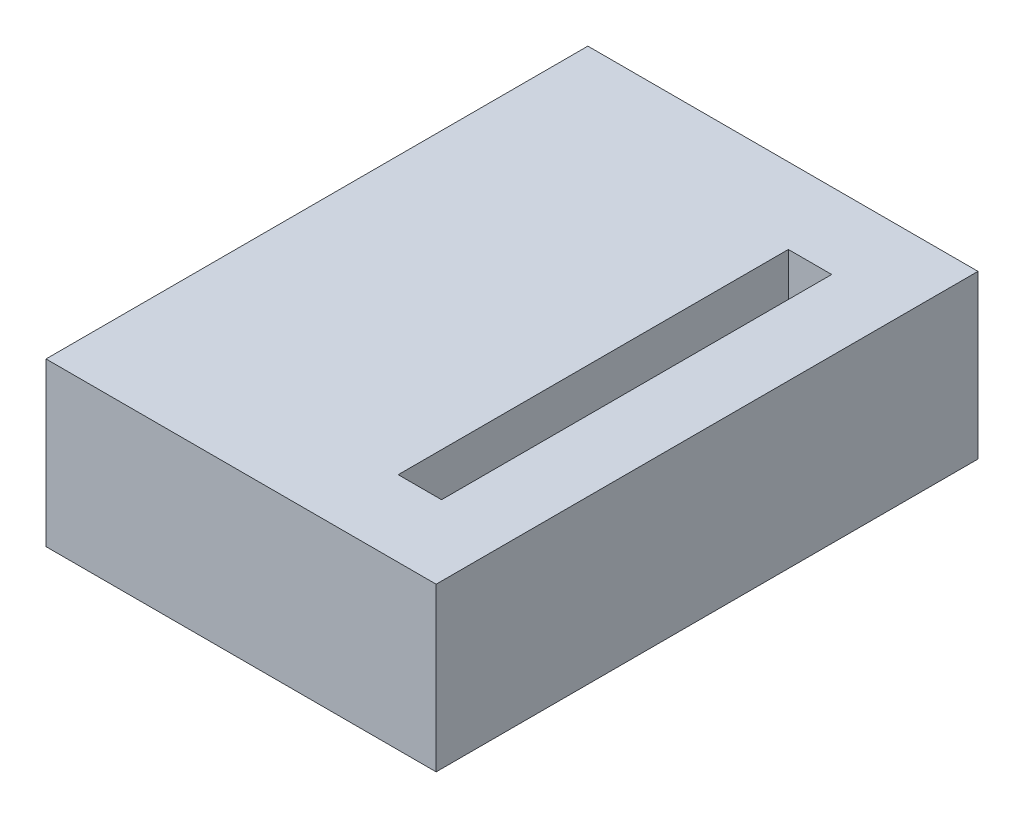
ISO-10303-21;
HEADER;
FILE_DESCRIPTION(('STEP AP214'),'2;1');
FILE_NAME('part.step','',(''),(''),'','','');
FILE_SCHEMA(('AUTOMOTIVE_DESIGN { 1 0 10303 214 1 1 1 1 }'));
ENDSEC;
DATA;
#1=APPLICATION_CONTEXT('core data for automotive mechanical design processes');
#2=APPLICATION_PROTOCOL_DEFINITION('international standard','automotive_design',2000,#1);
#3=PRODUCT_CONTEXT('',#1,'mechanical');
#4=PRODUCT('Part','Part','',(#3));
#5=PRODUCT_RELATED_PRODUCT_CATEGORY('part','',(#4));
#6=PRODUCT_DEFINITION_FORMATION('','',#4);
#7=PRODUCT_DEFINITION_CONTEXT('part definition',#1,'design');
#8=PRODUCT_DEFINITION('design','',#6,#7);
#9=PRODUCT_DEFINITION_SHAPE('','',#8);
#10=(LENGTH_UNIT() NAMED_UNIT(*) SI_UNIT(.MILLI.,.METRE.));
#11=(NAMED_UNIT(*) PLANE_ANGLE_UNIT() SI_UNIT($,.RADIAN.));
#12=(NAMED_UNIT(*) SI_UNIT($,.STERADIAN.) SOLID_ANGLE_UNIT());
#13=UNCERTAINTY_MEASURE_WITH_UNIT(LENGTH_MEASURE(1.E-05),#10,'distance_accuracy_value','');
#14=(GEOMETRIC_REPRESENTATION_CONTEXT(3) GLOBAL_UNCERTAINTY_ASSIGNED_CONTEXT((#13)) GLOBAL_UNIT_ASSIGNED_CONTEXT((#10,
#11,#12)) REPRESENTATION_CONTEXT('',''));
#15=CARTESIAN_POINT('',(0.,0.,0.));
#16=DIRECTION('',(0.,0.,1.));
#17=DIRECTION('',(1.,0.,0.));
#18=AXIS2_PLACEMENT_3D('',#15,#16,#17);
#19=CARTESIAN_POINT('',(0.,3.81,0.));
#20=DIRECTION('',(1.,0.,0.));
#21=DIRECTION('',(0.,0.,-1.));
#22=AXIS2_PLACEMENT_3D('',#19,#20,#21);
#23=PLANE('',#22);
#24=DIRECTION('',(0.,0.,1.));
#25=VECTOR('',#24,1.);
#26=CARTESIAN_POINT('',(0.,0.,0.));
#27=LINE('',#26,#25);
#28=CARTESIAN_POINT('',(0.,0.,-12.7));
#29=VERTEX_POINT('',#28);
#30=CARTESIAN_POINT('',(0.,0.,0.));
#31=VERTEX_POINT('',#30);
#32=EDGE_CURVE('E130',#29,#31,#27,.T.);
#33=ORIENTED_EDGE('',*,*,#32,.T.);
#34=DIRECTION('',(0.,-1.,0.));
#35=VECTOR('',#34,1.);
#36=CARTESIAN_POINT('',(0.,3.81,0.));
#37=LINE('',#36,#35);
#38=CARTESIAN_POINT('',(0.,3.81,0.));
#39=VERTEX_POINT('',#38);
#40=EDGE_CURVE('E11',#39,#31,#37,.T.);
#41=ORIENTED_EDGE('',*,*,#40,.F.);
#42=DIRECTION('',(0.,0.,1.));
#43=VECTOR('',#42,1.);
#44=CARTESIAN_POINT('',(0.,3.81,0.));
#45=LINE('',#44,#43);
#46=CARTESIAN_POINT('',(0.,3.81,-12.7));
#47=VERTEX_POINT('',#46);
#48=EDGE_CURVE('E134',#47,#39,#45,.T.);
#49=ORIENTED_EDGE('',*,*,#48,.F.);
#50=DIRECTION('',(0.,-1.,0.));
#51=VECTOR('',#50,1.);
#52=CARTESIAN_POINT('',(0.,3.81,-12.7));
#53=LINE('',#52,#51);
#54=EDGE_CURVE('E144',#47,#29,#53,.T.);
#55=ORIENTED_EDGE('',*,*,#54,.T.);
#56=EDGE_LOOP('',(#33,#41,#49,#55));
#57=FACE_BOUND('',#56,.T.);
#58=ADVANCED_FACE('F33',(#57),#23,.F.);
#59=CARTESIAN_POINT('',(0.,3.81,0.));
#60=DIRECTION('',(0.,0.,-1.));
#61=DIRECTION('',(-1.,0.,0.));
#62=AXIS2_PLACEMENT_3D('',#59,#60,#61);
#63=PLANE('',#62);
#64=DIRECTION('',(1.,0.,0.));
#65=VECTOR('',#64,1.);
#66=CARTESIAN_POINT('',(0.,0.,0.));
#67=LINE('',#66,#65);
#68=CARTESIAN_POINT('',(9.144,0.,0.));
#69=VERTEX_POINT('',#68);
#70=EDGE_CURVE('E147',#31,#69,#67,.T.);
#71=ORIENTED_EDGE('',*,*,#70,.T.);
#72=DIRECTION('',(0.,-1.,0.));
#73=VECTOR('',#72,1.);
#74=CARTESIAN_POINT('',(9.144,3.81,0.));
#75=LINE('',#74,#73);
#76=CARTESIAN_POINT('',(9.144,3.81,0.));
#77=VERTEX_POINT('',#76);
#78=EDGE_CURVE('E40',#77,#69,#75,.T.);
#79=ORIENTED_EDGE('',*,*,#78,.F.);
#80=DIRECTION('',(1.,0.,0.));
#81=VECTOR('',#80,1.);
#82=CARTESIAN_POINT('',(0.,3.81,0.));
#83=LINE('',#82,#81);
#84=EDGE_CURVE('E137',#39,#77,#83,.T.);
#85=ORIENTED_EDGE('',*,*,#84,.F.);
#86=ORIENTED_EDGE('',*,*,#40,.T.);
#87=EDGE_LOOP('',(#71,#79,#85,#86));
#88=FACE_BOUND('',#87,.T.);
#89=ADVANCED_FACE('F175',(#88),#63,.F.);
#90=CARTESIAN_POINT('',(9.144,3.81,0.));
#91=DIRECTION('',(-1.,0.,0.));
#92=DIRECTION('',(0.,0.,1.));
#93=AXIS2_PLACEMENT_3D('',#90,#91,#92);
#94=PLANE('',#93);
#95=DIRECTION('',(0.,0.,-1.));
#96=VECTOR('',#95,1.);
#97=CARTESIAN_POINT('',(9.144,0.,0.));
#98=LINE('',#97,#96);
#99=CARTESIAN_POINT('',(9.144,0.,-12.7));
#100=VERTEX_POINT('',#99);
#101=EDGE_CURVE('E149',#69,#100,#98,.T.);
#102=ORIENTED_EDGE('',*,*,#101,.T.);
#103=DIRECTION('',(0.,-1.,0.));
#104=VECTOR('',#103,1.);
#105=CARTESIAN_POINT('',(9.144,3.81,-12.7));
#106=LINE('',#105,#104);
#107=CARTESIAN_POINT('',(9.144,3.81,-12.7));
#108=VERTEX_POINT('',#107);
#109=EDGE_CURVE('E154',#108,#100,#106,.T.);
#110=ORIENTED_EDGE('',*,*,#109,.F.);
#111=DIRECTION('',(0.,0.,-1.));
#112=VECTOR('',#111,1.);
#113=CARTESIAN_POINT('',(9.144,3.81,0.));
#114=LINE('',#113,#112);
#115=EDGE_CURVE('E140',#77,#108,#114,.T.);
#116=ORIENTED_EDGE('',*,*,#115,.F.);
#117=ORIENTED_EDGE('',*,*,#78,.T.);
#118=EDGE_LOOP('',(#102,#110,#116,#117));
#119=FACE_BOUND('',#118,.T.);
#120=ADVANCED_FACE('F161',(#119),#94,.F.);
#121=CARTESIAN_POINT('',(0.,3.81,-12.7));
#122=DIRECTION('',(0.,0.,1.));
#123=DIRECTION('',(1.,0.,0.));
#124=AXIS2_PLACEMENT_3D('',#121,#122,#123);
#125=PLANE('',#124);
#126=DIRECTION('',(-1.,0.,0.));
#127=VECTOR('',#126,1.);
#128=CARTESIAN_POINT('',(0.,0.,-12.7));
#129=LINE('',#128,#127);
#130=EDGE_CURVE('E138',#100,#29,#129,.T.);
#131=ORIENTED_EDGE('',*,*,#130,.T.);
#132=ORIENTED_EDGE('',*,*,#54,.F.);
#133=DIRECTION('',(-1.,0.,0.));
#134=VECTOR('',#133,1.);
#135=CARTESIAN_POINT('',(0.,3.81,-12.7));
#136=LINE('',#135,#134);
#137=EDGE_CURVE('E142',#108,#47,#136,.T.);
#138=ORIENTED_EDGE('',*,*,#137,.F.);
#139=ORIENTED_EDGE('',*,*,#109,.T.);
#140=EDGE_LOOP('',(#131,#132,#138,#139));
#141=FACE_BOUND('',#140,.T.);
#142=ADVANCED_FACE('F168',(#141),#125,.F.);
#143=CARTESIAN_POINT('',(0.,3.81,0.));
#144=DIRECTION('',(0.,-1.,0.));
#145=DIRECTION('',(0.,0.,-1.));
#146=AXIS2_PLACEMENT_3D('',#143,#144,#145);
#147=PLANE('',#146);
#148=DIRECTION('',(-1.,0.,0.));
#149=VECTOR('',#148,1.);
#150=CARTESIAN_POINT('',(7.493,3.81,-10.922));
#151=LINE('',#150,#149);
#152=CARTESIAN_POINT('',(7.493,3.81,-10.922));
#153=VERTEX_POINT('',#152);
#154=CARTESIAN_POINT('',(6.477,3.81,-10.922));
#155=VERTEX_POINT('',#154);
#156=EDGE_CURVE('E124',#153,#155,#151,.T.);
#157=ORIENTED_EDGE('',*,*,#156,.F.);
#158=DIRECTION('',(0.,0.,-1.));
#159=VECTOR('',#158,1.);
#160=CARTESIAN_POINT('',(7.493,3.81,-1.778));
#161=LINE('',#160,#159);
#162=CARTESIAN_POINT('',(7.493,3.81,-1.778));
#163=VERTEX_POINT('',#162);
#164=EDGE_CURVE('E47',#163,#153,#161,.T.);
#165=ORIENTED_EDGE('',*,*,#164,.F.);
#166=DIRECTION('',(1.,0.,0.));
#167=VECTOR('',#166,1.);
#168=CARTESIAN_POINT('',(7.493,3.81,-1.778));
#169=LINE('',#168,#167);
#170=CARTESIAN_POINT('',(6.477,3.81,-1.778));
#171=VERTEX_POINT('',#170);
#172=EDGE_CURVE('E115',#171,#163,#169,.T.);
#173=ORIENTED_EDGE('',*,*,#172,.F.);
#174=DIRECTION('',(0.,0.,1.));
#175=VECTOR('',#174,1.);
#176=CARTESIAN_POINT('',(6.477,3.81,-1.778));
#177=LINE('',#176,#175);
#178=EDGE_CURVE('E118',#155,#171,#177,.T.);
#179=ORIENTED_EDGE('',*,*,#178,.F.);
#180=EDGE_LOOP('',(#157,#165,#173,#179));
#181=FACE_BOUND('',#180,.T.);
#182=ORIENTED_EDGE('',*,*,#48,.T.);
#183=ORIENTED_EDGE('',*,*,#84,.T.);
#184=ORIENTED_EDGE('',*,*,#115,.T.);
#185=ORIENTED_EDGE('',*,*,#137,.T.);
#186=EDGE_LOOP('',(#182,#183,#184,#185));
#187=FACE_BOUND('',#186,.T.);
#188=ADVANCED_FACE('F174',(#181,#187),#147,.F.);
#189=CARTESIAN_POINT('',(0.,0.,0.));
#190=DIRECTION('',(0.,-1.,0.));
#191=DIRECTION('',(0.,0.,-1.));
#192=AXIS2_PLACEMENT_3D('',#189,#190,#191);
#193=PLANE('',#192);
#194=DIRECTION('',(0.,0.,-1.));
#195=VECTOR('',#194,1.);
#196=CARTESIAN_POINT('',(7.493,0.,-1.778));
#197=LINE('',#196,#195);
#198=CARTESIAN_POINT('',(7.493,0.,-1.778));
#199=VERTEX_POINT('',#198);
#200=CARTESIAN_POINT('',(7.493,0.,-10.922));
#201=VERTEX_POINT('',#200);
#202=EDGE_CURVE('E99',#199,#201,#197,.T.);
#203=ORIENTED_EDGE('',*,*,#202,.T.);
#204=DIRECTION('',(-1.,0.,0.));
#205=VECTOR('',#204,1.);
#206=CARTESIAN_POINT('',(7.493,0.,-10.922));
#207=LINE('',#206,#205);
#208=CARTESIAN_POINT('',(6.477,0.,-10.922));
#209=VERTEX_POINT('',#208);
#210=EDGE_CURVE('E108',#201,#209,#207,.T.);
#211=ORIENTED_EDGE('',*,*,#210,.T.);
#212=DIRECTION('',(0.,0.,1.));
#213=VECTOR('',#212,1.);
#214=CARTESIAN_POINT('',(6.477,0.,-1.778));
#215=LINE('',#214,#213);
#216=CARTESIAN_POINT('',(6.477,0.,-1.778));
#217=VERTEX_POINT('',#216);
#218=EDGE_CURVE('E55',#209,#217,#215,.T.);
#219=ORIENTED_EDGE('',*,*,#218,.T.);
#220=DIRECTION('',(1.,0.,0.));
#221=VECTOR('',#220,1.);
#222=CARTESIAN_POINT('',(7.493,0.,-1.778));
#223=LINE('',#222,#221);
#224=EDGE_CURVE('E105',#217,#199,#223,.T.);
#225=ORIENTED_EDGE('',*,*,#224,.T.);
#226=EDGE_LOOP('',(#203,#211,#219,#225));
#227=FACE_BOUND('',#226,.T.);
#228=ORIENTED_EDGE('',*,*,#32,.F.);
#229=ORIENTED_EDGE('',*,*,#130,.F.);
#230=ORIENTED_EDGE('',*,*,#101,.F.);
#231=ORIENTED_EDGE('',*,*,#70,.F.);
#232=EDGE_LOOP('',(#228,#229,#230,#231));
#233=FACE_BOUND('',#232,.T.);
#234=ADVANCED_FACE('F112',(#227,#233),#193,.T.);
#235=CARTESIAN_POINT('',(7.493,0.,-1.778));
#236=DIRECTION('',(1.,0.,0.));
#237=DIRECTION('',(0.,0.,-1.));
#238=AXIS2_PLACEMENT_3D('',#235,#236,#237);
#239=PLANE('',#238);
#240=ORIENTED_EDGE('',*,*,#164,.T.);
#241=DIRECTION('',(0.,1.,0.));
#242=VECTOR('',#241,1.);
#243=CARTESIAN_POINT('',(7.493,0.,-10.922));
#244=LINE('',#243,#242);
#245=EDGE_CURVE('E95',#201,#153,#244,.T.);
#246=ORIENTED_EDGE('',*,*,#245,.F.);
#247=ORIENTED_EDGE('',*,*,#202,.F.);
#248=DIRECTION('',(0.,1.,0.));
#249=VECTOR('',#248,1.);
#250=CARTESIAN_POINT('',(7.493,0.,-1.778));
#251=LINE('',#250,#249);
#252=EDGE_CURVE('E128',#199,#163,#251,.T.);
#253=ORIENTED_EDGE('',*,*,#252,.T.);
#254=EDGE_LOOP('',(#240,#246,#247,#253));
#255=FACE_BOUND('',#254,.T.);
#256=ADVANCED_FACE('F97',(#255),#239,.F.);
#257=CARTESIAN_POINT('',(7.493,0.,-1.778));
#258=DIRECTION('',(0.,0.,1.));
#259=DIRECTION('',(1.,0.,0.));
#260=AXIS2_PLACEMENT_3D('',#257,#258,#259);
#261=PLANE('',#260);
#262=ORIENTED_EDGE('',*,*,#172,.T.);
#263=ORIENTED_EDGE('',*,*,#252,.F.);
#264=ORIENTED_EDGE('',*,*,#224,.F.);
#265=DIRECTION('',(0.,1.,0.));
#266=VECTOR('',#265,1.);
#267=CARTESIAN_POINT('',(6.477,0.,-1.778));
#268=LINE('',#267,#266);
#269=EDGE_CURVE('E131',#217,#171,#268,.T.);
#270=ORIENTED_EDGE('',*,*,#269,.T.);
#271=EDGE_LOOP('',(#262,#263,#264,#270));
#272=FACE_BOUND('',#271,.T.);
#273=ADVANCED_FACE('F192',(#272),#261,.F.);
#274=CARTESIAN_POINT('',(6.477,0.,-1.778));
#275=DIRECTION('',(-1.,0.,0.));
#276=DIRECTION('',(0.,0.,1.));
#277=AXIS2_PLACEMENT_3D('',#274,#275,#276);
#278=PLANE('',#277);
#279=ORIENTED_EDGE('',*,*,#178,.T.);
#280=ORIENTED_EDGE('',*,*,#269,.F.);
#281=ORIENTED_EDGE('',*,*,#218,.F.);
#282=DIRECTION('',(0.,1.,0.));
#283=VECTOR('',#282,1.);
#284=CARTESIAN_POINT('',(6.477,0.,-10.922));
#285=LINE('',#284,#283);
#286=EDGE_CURVE('E104',#209,#155,#285,.T.);
#287=ORIENTED_EDGE('',*,*,#286,.T.);
#288=EDGE_LOOP('',(#279,#280,#281,#287));
#289=FACE_BOUND('',#288,.T.);
#290=ADVANCED_FACE('F195',(#289),#278,.F.);
#291=CARTESIAN_POINT('',(7.493,0.,-10.922));
#292=DIRECTION('',(0.,0.,-1.));
#293=DIRECTION('',(-1.,0.,0.));
#294=AXIS2_PLACEMENT_3D('',#291,#292,#293);
#295=PLANE('',#294);
#296=ORIENTED_EDGE('',*,*,#156,.T.);
#297=ORIENTED_EDGE('',*,*,#286,.F.);
#298=ORIENTED_EDGE('',*,*,#210,.F.);
#299=ORIENTED_EDGE('',*,*,#245,.T.);
#300=EDGE_LOOP('',(#296,#297,#298,#299));
#301=FACE_BOUND('',#300,.T.);
#302=ADVANCED_FACE('F109',(#301),#295,.F.);
#303=CLOSED_SHELL('',(#58,#89,#120,#142,#188,#234,#256,#273,#290,#302));
#304=MANIFOLD_SOLID_BREP('B2',#303);
#305=ADVANCED_BREP_SHAPE_REPRESENTATION('',(#18,#304),#14);
#306=SHAPE_DEFINITION_REPRESENTATION(#9,#305);
ENDSEC;
END-ISO-10303-21;
